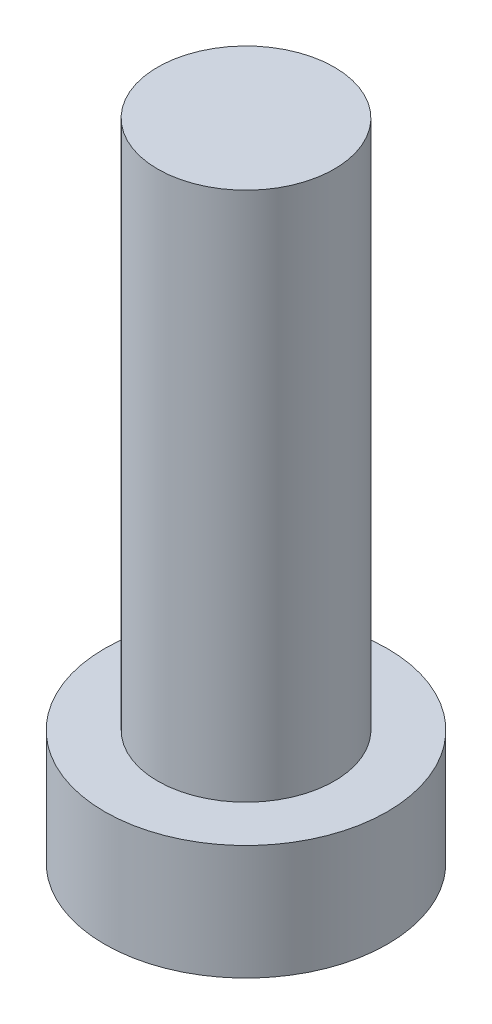
ISO-10303-21;
HEADER;
FILE_DESCRIPTION(('STEP AP214'),'2;1');
FILE_NAME('part.step','',(''),(''),'','','');
FILE_SCHEMA(('AUTOMOTIVE_DESIGN { 1 0 10303 214 1 1 1 1 }'));
ENDSEC;
DATA;
#1=APPLICATION_CONTEXT('core data for automotive mechanical design processes');
#2=APPLICATION_PROTOCOL_DEFINITION('international standard','automotive_design',2000,#1);
#3=PRODUCT_CONTEXT('',#1,'mechanical');
#4=PRODUCT('Part','Part','',(#3));
#5=PRODUCT_RELATED_PRODUCT_CATEGORY('part','',(#4));
#6=PRODUCT_DEFINITION_FORMATION('','',#4);
#7=PRODUCT_DEFINITION_CONTEXT('part definition',#1,'design');
#8=PRODUCT_DEFINITION('design','',#6,#7);
#9=PRODUCT_DEFINITION_SHAPE('','',#8);
#10=(LENGTH_UNIT() NAMED_UNIT(*) SI_UNIT(.MILLI.,.METRE.));
#11=(NAMED_UNIT(*) PLANE_ANGLE_UNIT() SI_UNIT($,.RADIAN.));
#12=(NAMED_UNIT(*) SI_UNIT($,.STERADIAN.) SOLID_ANGLE_UNIT());
#13=UNCERTAINTY_MEASURE_WITH_UNIT(LENGTH_MEASURE(1.E-05),#10,'distance_accuracy_value','');
#14=(GEOMETRIC_REPRESENTATION_CONTEXT(3) GLOBAL_UNCERTAINTY_ASSIGNED_CONTEXT((#13)) GLOBAL_UNIT_ASSIGNED_CONTEXT((#10,
#11,#12)) REPRESENTATION_CONTEXT('',''));
#15=CARTESIAN_POINT('',(0.,0.,0.));
#16=DIRECTION('',(0.,0.,1.));
#17=DIRECTION('',(1.,0.,0.));
#18=AXIS2_PLACEMENT_3D('',#15,#16,#17);
#19=CARTESIAN_POINT('',(0.,1.3,0.));
#20=DIRECTION('',(0.,-1.,0.));
#21=DIRECTION('',(0.,0.,-1.));
#22=AXIS2_PLACEMENT_3D('',#19,#20,#21);
#23=CYLINDRICAL_SURFACE('',#22,1.6);
#24=CARTESIAN_POINT('',(0.,1.3,0.));
#25=DIRECTION('',(0.,1.,0.));
#26=DIRECTION('',(0.,0.,1.));
#27=AXIS2_PLACEMENT_3D('',#24,#25,#26);
#28=CIRCLE('',#27,1.6);
#29=CARTESIAN_POINT('',(0.,1.3,1.6));
#30=VERTEX_POINT('',#29);
#31=EDGE_CURVE('E51',#30,#30,#28,.T.);
#32=ORIENTED_EDGE('',*,*,#31,.F.);
#33=EDGE_LOOP('',(#32));
#34=FACE_BOUND('',#33,.T.);
#35=CARTESIAN_POINT('',(0.,0.,0.));
#36=DIRECTION('',(0.,1.,0.));
#37=DIRECTION('',(0.,0.,1.));
#38=AXIS2_PLACEMENT_3D('',#35,#36,#37);
#39=CIRCLE('',#38,1.6);
#40=CARTESIAN_POINT('',(0.,0.,1.6));
#41=VERTEX_POINT('',#40);
#42=EDGE_CURVE('E46',#41,#41,#39,.T.);
#43=ORIENTED_EDGE('',*,*,#42,.T.);
#44=EDGE_LOOP('',(#43));
#45=FACE_BOUND('',#44,.T.);
#46=ADVANCED_FACE('F43',(#34,#45),#23,.T.);
#47=CARTESIAN_POINT('',(0.,1.3,0.));
#48=DIRECTION('',(0.,1.,0.));
#49=DIRECTION('',(0.,0.,1.));
#50=AXIS2_PLACEMENT_3D('',#47,#48,#49);
#51=PLANE('',#50);
#52=CARTESIAN_POINT('',(0.,1.3,0.));
#53=DIRECTION('',(0.,1.,0.));
#54=DIRECTION('',(0.,0.,1.));
#55=AXIS2_PLACEMENT_3D('',#52,#53,#54);
#56=CIRCLE('',#55,1.);
#57=CARTESIAN_POINT('',(0.,1.3,1.));
#58=VERTEX_POINT('',#57);
#59=EDGE_CURVE('E10',#58,#58,#56,.T.);
#60=ORIENTED_EDGE('',*,*,#59,.F.);
#61=EDGE_LOOP('',(#60));
#62=FACE_BOUND('',#61,.T.);
#63=ORIENTED_EDGE('',*,*,#31,.T.);
#64=EDGE_LOOP('',(#63));
#65=FACE_BOUND('',#64,.T.);
#66=ADVANCED_FACE('F71',(#62,#65),#51,.T.);
#67=CARTESIAN_POINT('',(0.,0.,0.));
#68=DIRECTION('',(0.,1.,0.));
#69=DIRECTION('',(0.,0.,1.));
#70=AXIS2_PLACEMENT_3D('',#67,#68,#69);
#71=PLANE('',#70);
#72=ORIENTED_EDGE('',*,*,#42,.F.);
#73=EDGE_LOOP('',(#72));
#74=FACE_BOUND('',#73,.T.);
#75=ADVANCED_FACE('F68',(#74),#71,.F.);
#76=CARTESIAN_POINT('',(0.,7.3,0.));
#77=DIRECTION('',(0.,-1.,0.));
#78=DIRECTION('',(0.,0.,-1.));
#79=AXIS2_PLACEMENT_3D('',#76,#77,#78);
#80=CYLINDRICAL_SURFACE('',#79,1.);
#81=CARTESIAN_POINT('',(0.,7.3,0.));
#82=DIRECTION('',(0.,1.,0.));
#83=DIRECTION('',(0.,0.,1.));
#84=AXIS2_PLACEMENT_3D('',#81,#82,#83);
#85=CIRCLE('',#84,1.);
#86=CARTESIAN_POINT('',(0.,7.3,1.));
#87=VERTEX_POINT('',#86);
#88=EDGE_CURVE('E58',#87,#87,#85,.T.);
#89=ORIENTED_EDGE('',*,*,#88,.F.);
#90=EDGE_LOOP('',(#89));
#91=FACE_BOUND('',#90,.T.);
#92=ORIENTED_EDGE('',*,*,#59,.T.);
#93=EDGE_LOOP('',(#92));
#94=FACE_BOUND('',#93,.T.);
#95=ADVANCED_FACE('F70',(#91,#94),#80,.T.);
#96=CARTESIAN_POINT('',(0.,7.3,0.));
#97=DIRECTION('',(0.,1.,0.));
#98=DIRECTION('',(0.,0.,1.));
#99=AXIS2_PLACEMENT_3D('',#96,#97,#98);
#100=PLANE('',#99);
#101=ORIENTED_EDGE('',*,*,#88,.T.);
#102=EDGE_LOOP('',(#101));
#103=FACE_BOUND('',#102,.T.);
#104=ADVANCED_FACE('F76',(#103),#100,.T.);
#105=CLOSED_SHELL('',(#46,#66,#75,#95,#104));
#106=MANIFOLD_SOLID_BREP('B2',#105);
#107=ADVANCED_BREP_SHAPE_REPRESENTATION('',(#18,#106),#14);
#108=SHAPE_DEFINITION_REPRESENTATION(#9,#107);
ENDSEC;
END-ISO-10303-21;
